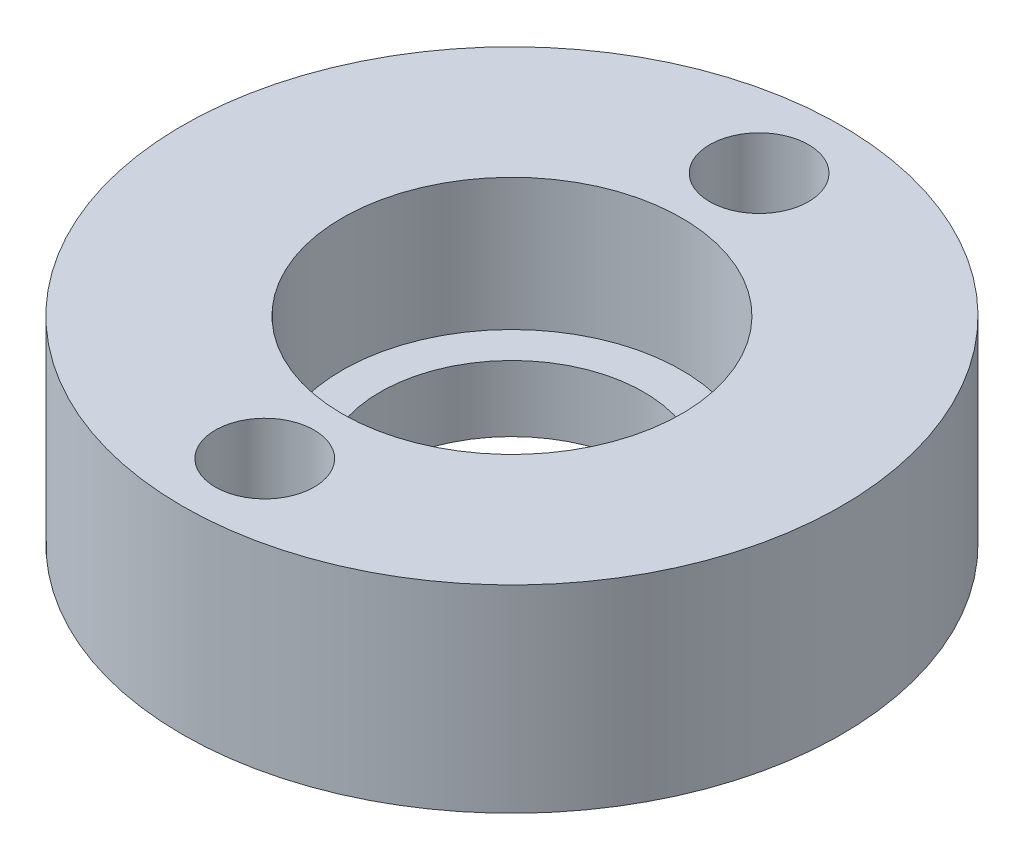
ISO-10303-21;
HEADER;
FILE_DESCRIPTION(('STEP AP214'),'2;1');
FILE_NAME('part.step','',(''),(''),'','','');
FILE_SCHEMA(('AUTOMOTIVE_DESIGN { 1 0 10303 214 1 1 1 1 }'));
ENDSEC;
DATA;
#1=APPLICATION_CONTEXT('core data for automotive mechanical design processes');
#2=APPLICATION_PROTOCOL_DEFINITION('international standard','automotive_design',2000,#1);
#3=PRODUCT_CONTEXT('',#1,'mechanical');
#4=PRODUCT('Part','Part','',(#3));
#5=PRODUCT_RELATED_PRODUCT_CATEGORY('part','',(#4));
#6=PRODUCT_DEFINITION_FORMATION('','',#4);
#7=PRODUCT_DEFINITION_CONTEXT('part definition',#1,'design');
#8=PRODUCT_DEFINITION('design','',#6,#7);
#9=PRODUCT_DEFINITION_SHAPE('','',#8);
#10=(LENGTH_UNIT() NAMED_UNIT(*) SI_UNIT(.MILLI.,.METRE.));
#11=(NAMED_UNIT(*) PLANE_ANGLE_UNIT() SI_UNIT($,.RADIAN.));
#12=(NAMED_UNIT(*) SI_UNIT($,.STERADIAN.) SOLID_ANGLE_UNIT());
#13=UNCERTAINTY_MEASURE_WITH_UNIT(LENGTH_MEASURE(1.E-05),#10,'distance_accuracy_value','');
#14=(GEOMETRIC_REPRESENTATION_CONTEXT(3) GLOBAL_UNCERTAINTY_ASSIGNED_CONTEXT((#13)) GLOBAL_UNIT_ASSIGNED_CONTEXT((#10,
#11,#12)) REPRESENTATION_CONTEXT('',''));
#15=CARTESIAN_POINT('',(0.,0.,0.));
#16=DIRECTION('',(0.,0.,1.));
#17=DIRECTION('',(1.,0.,0.));
#18=AXIS2_PLACEMENT_3D('',#15,#16,#17);
#19=CARTESIAN_POINT('',(0.,6.,0.));
#20=DIRECTION('',(0.,-1.,0.));
#21=DIRECTION('',(0.,0.,-1.));
#22=AXIS2_PLACEMENT_3D('',#19,#20,#21);
#23=CYLINDRICAL_SURFACE('',#22,4.);
#24=CARTESIAN_POINT('',(0.,0.,0.));
#25=DIRECTION('',(0.,1.,0.));
#26=DIRECTION('',(0.,0.,1.));
#27=AXIS2_PLACEMENT_3D('',#24,#25,#26);
#28=CIRCLE('',#27,4.);
#29=CARTESIAN_POINT('',(0.,0.,4.));
#30=VERTEX_POINT('',#29);
#31=EDGE_CURVE('E57',#30,#30,#28,.T.);
#32=ORIENTED_EDGE('',*,*,#31,.F.);
#33=EDGE_LOOP('',(#32));
#34=FACE_BOUND('',#33,.T.);
#35=CARTESIAN_POINT('',(0.,2.,0.));
#36=DIRECTION('',(0.,1.,0.));
#37=DIRECTION('',(0.,0.,1.));
#38=AXIS2_PLACEMENT_3D('',#35,#36,#37);
#39=CIRCLE('',#38,4.);
#40=CARTESIAN_POINT('',(0.,2.,4.));
#41=VERTEX_POINT('',#40);
#42=EDGE_CURVE('E37',#41,#41,#39,.T.);
#43=ORIENTED_EDGE('',*,*,#42,.T.);
#44=EDGE_LOOP('',(#43));
#45=FACE_BOUND('',#44,.T.);
#46=ADVANCED_FACE('F33',(#34,#45),#23,.F.);
#47=CARTESIAN_POINT('',(0.,6.,0.));
#48=DIRECTION('',(0.,1.,0.));
#49=DIRECTION('',(0.,0.,1.));
#50=AXIS2_PLACEMENT_3D('',#47,#48,#49);
#51=PLANE('',#50);
#52=CARTESIAN_POINT('',(0.,6.,0.));
#53=DIRECTION('',(0.,1.,0.));
#54=DIRECTION('',(0.,0.,1.));
#55=AXIS2_PLACEMENT_3D('',#52,#53,#54);
#56=CIRCLE('',#55,5.15);
#57=CARTESIAN_POINT('',(0.,6.,5.15));
#58=VERTEX_POINT('',#57);
#59=EDGE_CURVE('E62',#58,#58,#56,.T.);
#60=ORIENTED_EDGE('',*,*,#59,.F.);
#61=EDGE_LOOP('',(#60));
#62=FACE_BOUND('',#61,.T.);
#63=CARTESIAN_POINT('',(0.,6.,7.5));
#64=DIRECTION('',(0.,1.,0.));
#65=DIRECTION('',(0.,0.,1.));
#66=AXIS2_PLACEMENT_3D('',#63,#64,#65);
#67=CIRCLE('',#66,1.5);
#68=CARTESIAN_POINT('',(0.,6.,9.));
#69=VERTEX_POINT('',#68);
#70=EDGE_CURVE('E51',#69,#69,#67,.T.);
#71=ORIENTED_EDGE('',*,*,#70,.F.);
#72=EDGE_LOOP('',(#71));
#73=FACE_BOUND('',#72,.T.);
#74=CARTESIAN_POINT('',(0.,6.,0.));
#75=DIRECTION('',(0.,1.,0.));
#76=DIRECTION('',(0.,0.,1.));
#77=AXIS2_PLACEMENT_3D('',#74,#75,#76);
#78=CIRCLE('',#77,10.);
#79=CARTESIAN_POINT('',(0.,6.,10.));
#80=VERTEX_POINT('',#79);
#81=EDGE_CURVE('E10',#80,#80,#78,.T.);
#82=ORIENTED_EDGE('',*,*,#81,.T.);
#83=EDGE_LOOP('',(#82));
#84=FACE_BOUND('',#83,.T.);
#85=CARTESIAN_POINT('',(0.,6.,-7.5));
#86=DIRECTION('',(0.,1.,0.));
#87=DIRECTION('',(0.,0.,1.));
#88=AXIS2_PLACEMENT_3D('',#85,#86,#87);
#89=CIRCLE('',#88,1.5);
#90=CARTESIAN_POINT('',(0.,6.,-6.));
#91=VERTEX_POINT('',#90);
#92=EDGE_CURVE('E46',#91,#91,#89,.T.);
#93=ORIENTED_EDGE('',*,*,#92,.F.);
#94=EDGE_LOOP('',(#93));
#95=FACE_BOUND('',#94,.T.);
#96=ADVANCED_FACE('F84',(#62,#73,#84,#95),#51,.T.);
#97=CARTESIAN_POINT('',(0.,0.,0.));
#98=DIRECTION('',(0.,1.,0.));
#99=DIRECTION('',(0.,0.,1.));
#100=AXIS2_PLACEMENT_3D('',#97,#98,#99);
#101=PLANE('',#100);
#102=CARTESIAN_POINT('',(0.,0.,0.));
#103=DIRECTION('',(0.,1.,0.));
#104=DIRECTION('',(0.,0.,1.));
#105=AXIS2_PLACEMENT_3D('',#102,#103,#104);
#106=CIRCLE('',#105,10.);
#107=CARTESIAN_POINT('',(0.,0.,10.));
#108=VERTEX_POINT('',#107);
#109=EDGE_CURVE('E41',#108,#108,#106,.T.);
#110=ORIENTED_EDGE('',*,*,#109,.F.);
#111=EDGE_LOOP('',(#110));
#112=FACE_BOUND('',#111,.T.);
#113=CARTESIAN_POINT('',(0.,0.,-7.5));
#114=DIRECTION('',(0.,1.,0.));
#115=DIRECTION('',(0.,0.,1.));
#116=AXIS2_PLACEMENT_3D('',#113,#114,#115);
#117=CIRCLE('',#116,1.5);
#118=CARTESIAN_POINT('',(0.,0.,-6.));
#119=VERTEX_POINT('',#118);
#120=EDGE_CURVE('E48',#119,#119,#117,.T.);
#121=ORIENTED_EDGE('',*,*,#120,.T.);
#122=EDGE_LOOP('',(#121));
#123=FACE_BOUND('',#122,.T.);
#124=CARTESIAN_POINT('',(0.,0.,7.5));
#125=DIRECTION('',(0.,1.,0.));
#126=DIRECTION('',(0.,0.,1.));
#127=AXIS2_PLACEMENT_3D('',#124,#125,#126);
#128=CIRCLE('',#127,1.5);
#129=CARTESIAN_POINT('',(0.,0.,9.));
#130=VERTEX_POINT('',#129);
#131=EDGE_CURVE('E54',#130,#130,#128,.T.);
#132=ORIENTED_EDGE('',*,*,#131,.T.);
#133=EDGE_LOOP('',(#132));
#134=FACE_BOUND('',#133,.T.);
#135=ORIENTED_EDGE('',*,*,#31,.T.);
#136=EDGE_LOOP('',(#135));
#137=FACE_BOUND('',#136,.T.);
#138=ADVANCED_FACE('F90',(#112,#123,#134,#137),#101,.F.);
#139=CARTESIAN_POINT('',(0.,6.,0.));
#140=DIRECTION('',(0.,-1.,0.));
#141=DIRECTION('',(0.,0.,-1.));
#142=AXIS2_PLACEMENT_3D('',#139,#140,#141);
#143=CYLINDRICAL_SURFACE('',#142,10.);
#144=ORIENTED_EDGE('',*,*,#81,.F.);
#145=EDGE_LOOP('',(#144));
#146=FACE_BOUND('',#145,.T.);
#147=ORIENTED_EDGE('',*,*,#109,.T.);
#148=EDGE_LOOP('',(#147));
#149=FACE_BOUND('',#148,.T.);
#150=ADVANCED_FACE('F35',(#146,#149),#143,.T.);
#151=CARTESIAN_POINT('',(0.,6.,-7.5));
#152=DIRECTION('',(0.,-1.,0.));
#153=DIRECTION('',(0.,0.,-1.));
#154=AXIS2_PLACEMENT_3D('',#151,#152,#153);
#155=CYLINDRICAL_SURFACE('',#154,1.5);
#156=ORIENTED_EDGE('',*,*,#92,.T.);
#157=EDGE_LOOP('',(#156));
#158=FACE_BOUND('',#157,.T.);
#159=ORIENTED_EDGE('',*,*,#120,.F.);
#160=EDGE_LOOP('',(#159));
#161=FACE_BOUND('',#160,.T.);
#162=ADVANCED_FACE('F97',(#158,#161),#155,.F.);
#163=CARTESIAN_POINT('',(0.,6.,7.5));
#164=DIRECTION('',(0.,-1.,0.));
#165=DIRECTION('',(0.,0.,-1.));
#166=AXIS2_PLACEMENT_3D('',#163,#164,#165);
#167=CYLINDRICAL_SURFACE('',#166,1.5);
#168=ORIENTED_EDGE('',*,*,#70,.T.);
#169=EDGE_LOOP('',(#168));
#170=FACE_BOUND('',#169,.T.);
#171=ORIENTED_EDGE('',*,*,#131,.F.);
#172=EDGE_LOOP('',(#171));
#173=FACE_BOUND('',#172,.T.);
#174=ADVANCED_FACE('F80',(#170,#173),#167,.F.);
#175=CARTESIAN_POINT('',(0.,2.,0.));
#176=DIRECTION('',(0.,1.,0.));
#177=DIRECTION('',(0.,0.,1.));
#178=AXIS2_PLACEMENT_3D('',#175,#176,#177);
#179=CYLINDRICAL_SURFACE('',#178,5.15);
#180=CARTESIAN_POINT('',(0.,2.,0.));
#181=DIRECTION('',(0.,1.,0.));
#182=DIRECTION('',(0.,0.,1.));
#183=AXIS2_PLACEMENT_3D('',#180,#181,#182);
#184=CIRCLE('',#183,5.15);
#185=CARTESIAN_POINT('',(0.,2.,5.15));
#186=VERTEX_POINT('',#185);
#187=EDGE_CURVE('E65',#186,#186,#184,.T.);
#188=ORIENTED_EDGE('',*,*,#187,.F.);
#189=EDGE_LOOP('',(#188));
#190=FACE_BOUND('',#189,.T.);
#191=ORIENTED_EDGE('',*,*,#59,.T.);
#192=EDGE_LOOP('',(#191));
#193=FACE_BOUND('',#192,.T.);
#194=ADVANCED_FACE('F75',(#190,#193),#179,.F.);
#195=CARTESIAN_POINT('',(0.,2.,0.));
#196=DIRECTION('',(0.,1.,0.));
#197=DIRECTION('',(0.,0.,1.));
#198=AXIS2_PLACEMENT_3D('',#195,#196,#197);
#199=PLANE('',#198);
#200=ORIENTED_EDGE('',*,*,#42,.F.);
#201=EDGE_LOOP('',(#200));
#202=FACE_BOUND('',#201,.T.);
#203=ORIENTED_EDGE('',*,*,#187,.T.);
#204=EDGE_LOOP('',(#203));
#205=FACE_BOUND('',#204,.T.);
#206=ADVANCED_FACE('F73',(#202,#205),#199,.T.);
#207=CLOSED_SHELL('',(#46,#96,#138,#150,#162,#174,#194,#206));
#208=MANIFOLD_SOLID_BREP('B2',#207);
#209=ADVANCED_BREP_SHAPE_REPRESENTATION('',(#18,#208),#14);
#210=SHAPE_DEFINITION_REPRESENTATION(#9,#209);
ENDSEC;
END-ISO-10303-21;
